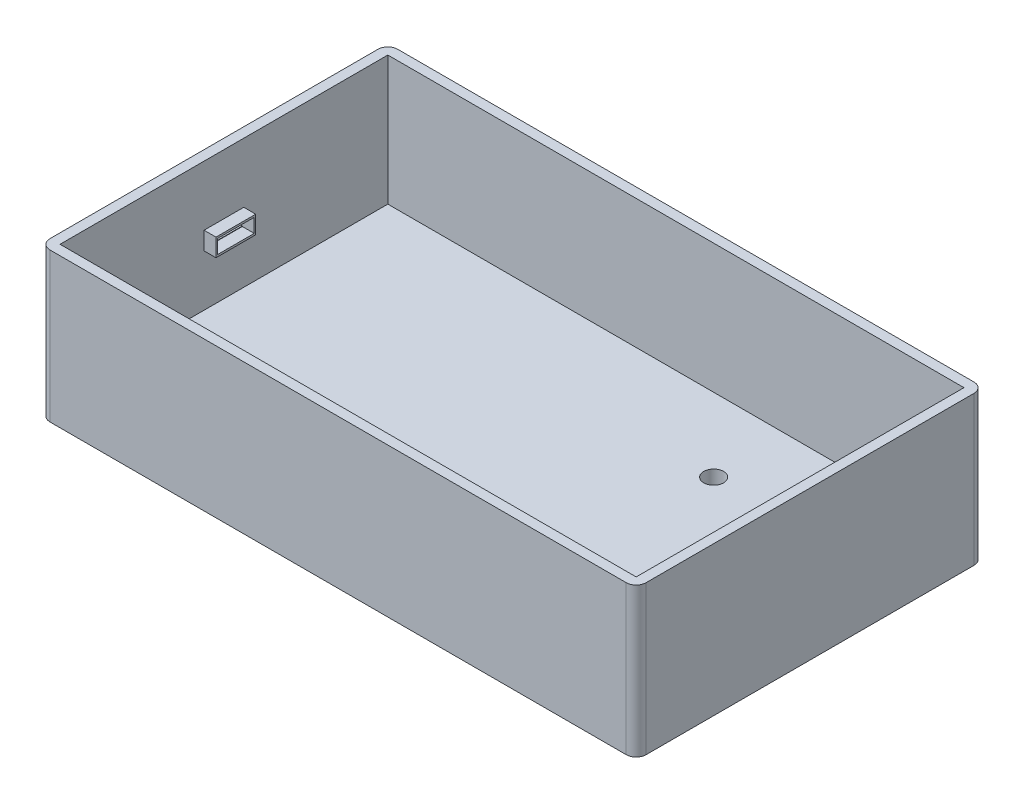
ISO-10303-21;
HEADER;
FILE_DESCRIPTION(('STEP AP214'),'2;1');
FILE_NAME('part.step','',(''),(''),'','','');
FILE_SCHEMA(('AUTOMOTIVE_DESIGN { 1 0 10303 214 1 1 1 1 }'));
ENDSEC;
DATA;
#1=APPLICATION_CONTEXT('core data for automotive mechanical design processes');
#2=APPLICATION_PROTOCOL_DEFINITION('international standard','automotive_design',2000,#1);
#3=PRODUCT_CONTEXT('',#1,'mechanical');
#4=PRODUCT('Part','Part','',(#3));
#5=PRODUCT_RELATED_PRODUCT_CATEGORY('part','',(#4));
#6=PRODUCT_DEFINITION_FORMATION('','',#4);
#7=PRODUCT_DEFINITION_CONTEXT('part definition',#1,'design');
#8=PRODUCT_DEFINITION('design','',#6,#7);
#9=PRODUCT_DEFINITION_SHAPE('','',#8);
#10=(LENGTH_UNIT() NAMED_UNIT(*) SI_UNIT(.MILLI.,.METRE.));
#11=(NAMED_UNIT(*) PLANE_ANGLE_UNIT() SI_UNIT($,.RADIAN.));
#12=(NAMED_UNIT(*) SI_UNIT($,.STERADIAN.) SOLID_ANGLE_UNIT());
#13=UNCERTAINTY_MEASURE_WITH_UNIT(LENGTH_MEASURE(1.E-05),#10,'distance_accuracy_value','');
#14=(GEOMETRIC_REPRESENTATION_CONTEXT(3) GLOBAL_UNCERTAINTY_ASSIGNED_CONTEXT((#13)) GLOBAL_UNIT_ASSIGNED_CONTEXT((#10,
#11,#12)) REPRESENTATION_CONTEXT('',''));
#15=CARTESIAN_POINT('',(0.,0.,0.));
#16=DIRECTION('',(0.,0.,1.));
#17=DIRECTION('',(1.,0.,0.));
#18=AXIS2_PLACEMENT_3D('',#15,#16,#17);
#19=CARTESIAN_POINT('',(-73.66,5.08,41.91));
#20=DIRECTION('',(-1.,0.,0.));
#21=DIRECTION('',(0.,0.,1.));
#22=AXIS2_PLACEMENT_3D('',#19,#20,#21);
#23=PLANE('',#22);
#24=DIRECTION('',(0.,0.,1.));
#25=VECTOR('',#24,1.);
#26=CARTESIAN_POINT('',(-73.66,38.1,41.91));
#27=LINE('',#26,#25);
#28=CARTESIAN_POINT('',(-73.66,38.1,-41.91));
#29=VERTEX_POINT('',#28);
#30=CARTESIAN_POINT('',(-73.66,38.1,41.91));
#31=VERTEX_POINT('',#30);
#32=EDGE_CURVE('E353',#29,#31,#27,.T.);
#33=ORIENTED_EDGE('',*,*,#32,.T.);
#34=DIRECTION('',(0.,1.,0.));
#35=VECTOR('',#34,1.);
#36=CARTESIAN_POINT('',(-73.66,5.08,41.91));
#37=LINE('',#36,#35);
#38=CARTESIAN_POINT('',(-73.66,5.08,41.91));
#39=VERTEX_POINT('',#38);
#40=EDGE_CURVE('E364',#39,#31,#37,.T.);
#41=ORIENTED_EDGE('',*,*,#40,.F.);
#42=DIRECTION('',(0.,0.,1.));
#43=VECTOR('',#42,1.);
#44=CARTESIAN_POINT('',(-73.66,5.08,41.91));
#45=LINE('',#44,#43);
#46=CARTESIAN_POINT('',(-73.66,5.08,-41.91));
#47=VERTEX_POINT('',#46);
#48=EDGE_CURVE('E338',#47,#39,#45,.T.);
#49=ORIENTED_EDGE('',*,*,#48,.F.);
#50=DIRECTION('',(0.,1.,0.));
#51=VECTOR('',#50,1.);
#52=CARTESIAN_POINT('',(-73.66,5.08,-41.91));
#53=LINE('',#52,#51);
#54=EDGE_CURVE('E367',#47,#29,#53,.T.);
#55=ORIENTED_EDGE('',*,*,#54,.T.);
#56=EDGE_LOOP('',(#33,#41,#49,#55));
#57=FACE_BOUND('',#56,.T.);
#58=DIRECTION('',(0.,1.,0.));
#59=VECTOR('',#58,1.);
#60=CARTESIAN_POINT('',(-73.66,18.2245,-5.08));
#61=LINE('',#60,#59);
#62=CARTESIAN_POINT('',(-73.66,18.2245,-5.08));
#63=VERTEX_POINT('',#62);
#64=CARTESIAN_POINT('',(-73.66,22.7965,-5.08));
#65=VERTEX_POINT('',#64);
#66=EDGE_CURVE('E249',#63,#65,#61,.T.);
#67=ORIENTED_EDGE('',*,*,#66,.F.);
#68=DIRECTION('',(0.,0.,-1.));
#69=VECTOR('',#68,1.);
#70=CARTESIAN_POINT('',(-73.66,18.2245,5.08));
#71=LINE('',#70,#69);
#72=CARTESIAN_POINT('',(-73.66,18.2245,5.07999999999999));
#73=VERTEX_POINT('',#72);
#74=EDGE_CURVE('E255',#73,#63,#71,.T.);
#75=ORIENTED_EDGE('',*,*,#74,.F.);
#76=DIRECTION('',(0.,-1.,0.));
#77=VECTOR('',#76,1.);
#78=CARTESIAN_POINT('',(-73.66,18.2245,5.08));
#79=LINE('',#78,#77);
#80=CARTESIAN_POINT('',(-73.66,22.7965,5.07999999999999));
#81=VERTEX_POINT('',#80);
#82=EDGE_CURVE('E68',#81,#73,#79,.T.);
#83=ORIENTED_EDGE('',*,*,#82,.F.);
#84=DIRECTION('',(0.,0.,1.));
#85=VECTOR('',#84,1.);
#86=CARTESIAN_POINT('',(-73.66,22.7965,5.08));
#87=LINE('',#86,#85);
#88=EDGE_CURVE('E63',#65,#81,#87,.T.);
#89=ORIENTED_EDGE('',*,*,#88,.F.);
#90=EDGE_LOOP('',(#67,#75,#83,#89));
#91=FACE_BOUND('',#90,.T.);
#92=ADVANCED_FACE('F47',(#57,#91),#23,.F.);
#93=CARTESIAN_POINT('',(76.2,38.1,44.45));
#94=DIRECTION('',(-1.,0.,0.));
#95=DIRECTION('',(0.,0.,1.));
#96=AXIS2_PLACEMENT_3D('',#93,#94,#95);
#97=PLANE('',#96);
#98=DIRECTION('',(0.,0.,-1.));
#99=VECTOR('',#98,1.);
#100=CARTESIAN_POINT('',(76.2,38.1,44.45));
#101=LINE('',#100,#99);
#102=CARTESIAN_POINT('',(76.2,38.1,41.91));
#103=VERTEX_POINT('',#102);
#104=CARTESIAN_POINT('',(76.2,38.1,-41.91));
#105=VERTEX_POINT('',#104);
#106=EDGE_CURVE('E373',#103,#105,#101,.T.);
#107=ORIENTED_EDGE('',*,*,#106,.F.);
#108=DIRECTION('',(0.,-1.,0.));
#109=VECTOR('',#108,1.);
#110=CARTESIAN_POINT('',(76.2,38.1,41.91));
#111=LINE('',#110,#109);
#112=CARTESIAN_POINT('',(76.2,0.,41.91));
#113=VERTEX_POINT('',#112);
#114=EDGE_CURVE('E11',#103,#113,#111,.T.);
#115=ORIENTED_EDGE('',*,*,#114,.T.);
#116=DIRECTION('',(0.,0.,-1.));
#117=VECTOR('',#116,1.);
#118=CARTESIAN_POINT('',(76.2,0.,44.45));
#119=LINE('',#118,#117);
#120=CARTESIAN_POINT('',(76.2,0.,-41.91));
#121=VERTEX_POINT('',#120);
#122=EDGE_CURVE('E363',#113,#121,#119,.T.);
#123=ORIENTED_EDGE('',*,*,#122,.T.);
#124=DIRECTION('',(0.,-1.,0.));
#125=VECTOR('',#124,1.);
#126=CARTESIAN_POINT('',(76.2,38.1,-41.91));
#127=LINE('',#126,#125);
#128=EDGE_CURVE('E56',#121,#105,#127,.F.);
#129=ORIENTED_EDGE('',*,*,#128,.T.);
#130=EDGE_LOOP('',(#107,#115,#123,#129));
#131=FACE_BOUND('',#130,.T.);
#132=ADVANCED_FACE('F452',(#131),#97,.F.);
#133=CARTESIAN_POINT('',(-76.2,38.1,-44.45));
#134=DIRECTION('',(0.,0.,1.));
#135=DIRECTION('',(1.,0.,0.));
#136=AXIS2_PLACEMENT_3D('',#133,#134,#135);
#137=PLANE('',#136);
#138=DIRECTION('',(-1.,0.,0.));
#139=VECTOR('',#138,1.);
#140=CARTESIAN_POINT('',(-76.2,0.,-44.45));
#141=LINE('',#140,#139);
#142=CARTESIAN_POINT('',(73.66,0.,-44.45));
#143=VERTEX_POINT('',#142);
#144=CARTESIAN_POINT('',(-73.66,0.,-44.45));
#145=VERTEX_POINT('',#144);
#146=EDGE_CURVE('E394',#143,#145,#141,.T.);
#147=ORIENTED_EDGE('',*,*,#146,.T.);
#148=DIRECTION('',(0.,-1.,0.));
#149=VECTOR('',#148,1.);
#150=CARTESIAN_POINT('',(-73.66,38.1,-44.45));
#151=LINE('',#150,#149);
#152=CARTESIAN_POINT('',(-73.66,38.1,-44.45));
#153=VERTEX_POINT('',#152);
#154=EDGE_CURVE('E446',#145,#153,#151,.F.);
#155=ORIENTED_EDGE('',*,*,#154,.T.);
#156=DIRECTION('',(-1.,0.,0.));
#157=VECTOR('',#156,1.);
#158=CARTESIAN_POINT('',(-76.2,38.1,-44.45));
#159=LINE('',#158,#157);
#160=CARTESIAN_POINT('',(73.66,38.1,-44.45));
#161=VERTEX_POINT('',#160);
#162=EDGE_CURVE('E377',#161,#153,#159,.T.);
#163=ORIENTED_EDGE('',*,*,#162,.F.);
#164=DIRECTION('',(0.,-1.,0.));
#165=VECTOR('',#164,1.);
#166=CARTESIAN_POINT('',(73.66,38.1,-44.45));
#167=LINE('',#166,#165);
#168=EDGE_CURVE('E442',#161,#143,#167,.T.);
#169=ORIENTED_EDGE('',*,*,#168,.T.);
#170=EDGE_LOOP('',(#147,#155,#163,#169));
#171=FACE_BOUND('',#170,.T.);
#172=ADVANCED_FACE('F464',(#171),#137,.F.);
#173=CARTESIAN_POINT('',(-76.2,38.1,44.45));
#174=DIRECTION('',(1.,0.,0.));
#175=DIRECTION('',(0.,0.,-1.));
#176=AXIS2_PLACEMENT_3D('',#173,#174,#175);
#177=PLANE('',#176);
#178=DIRECTION('',(0.,0.,-1.));
#179=VECTOR('',#178,1.);
#180=CARTESIAN_POINT('',(-76.2,22.2885,-4.699));
#181=LINE('',#180,#179);
#182=CARTESIAN_POINT('',(-76.2,22.2885,4.699));
#183=VERTEX_POINT('',#182);
#184=CARTESIAN_POINT('',(-76.2,22.2885,-4.699));
#185=VERTEX_POINT('',#184);
#186=EDGE_CURVE('E203',#183,#185,#181,.T.);
#187=ORIENTED_EDGE('',*,*,#186,.F.);
#188=DIRECTION('',(0.,1.,0.));
#189=VECTOR('',#188,1.);
#190=CARTESIAN_POINT('',(-76.2,18.8595,4.699));
#191=LINE('',#190,#189);
#192=CARTESIAN_POINT('',(-76.2,18.8595,4.699));
#193=VERTEX_POINT('',#192);
#194=EDGE_CURVE('E294',#193,#183,#191,.T.);
#195=ORIENTED_EDGE('',*,*,#194,.F.);
#196=DIRECTION('',(0.,0.,1.));
#197=VECTOR('',#196,1.);
#198=CARTESIAN_POINT('',(-76.2,18.8595,-4.699));
#199=LINE('',#198,#197);
#200=CARTESIAN_POINT('',(-76.2,18.8595,-4.699));
#201=VERTEX_POINT('',#200);
#202=EDGE_CURVE('E319',#201,#193,#199,.T.);
#203=ORIENTED_EDGE('',*,*,#202,.F.);
#204=DIRECTION('',(0.,-1.,0.));
#205=VECTOR('',#204,1.);
#206=CARTESIAN_POINT('',(-76.2,18.8595,-4.699));
#207=LINE('',#206,#205);
#208=EDGE_CURVE('E316',#185,#201,#207,.T.);
#209=ORIENTED_EDGE('',*,*,#208,.F.);
#210=EDGE_LOOP('',(#187,#195,#203,#209));
#211=FACE_BOUND('',#210,.T.);
#212=DIRECTION('',(0.,0.,1.));
#213=VECTOR('',#212,1.);
#214=CARTESIAN_POINT('',(-76.2,0.,44.45));
#215=LINE('',#214,#213);
#216=CARTESIAN_POINT('',(-76.2,0.,-41.91));
#217=VERTEX_POINT('',#216);
#218=CARTESIAN_POINT('',(-76.2,0.,41.91));
#219=VERTEX_POINT('',#218);
#220=EDGE_CURVE('E398',#217,#219,#215,.T.);
#221=ORIENTED_EDGE('',*,*,#220,.T.);
#222=DIRECTION('',(0.,-1.,0.));
#223=VECTOR('',#222,1.);
#224=CARTESIAN_POINT('',(-76.2,38.1,41.91));
#225=LINE('',#224,#223);
#226=CARTESIAN_POINT('',(-76.2,38.1,41.91));
#227=VERTEX_POINT('',#226);
#228=EDGE_CURVE('E427',#219,#227,#225,.F.);
#229=ORIENTED_EDGE('',*,*,#228,.T.);
#230=DIRECTION('',(0.,0.,1.));
#231=VECTOR('',#230,1.);
#232=CARTESIAN_POINT('',(-76.2,38.1,44.45));
#233=LINE('',#232,#231);
#234=CARTESIAN_POINT('',(-76.2,38.1,-41.91));
#235=VERTEX_POINT('',#234);
#236=EDGE_CURVE('E382',#235,#227,#233,.T.);
#237=ORIENTED_EDGE('',*,*,#236,.F.);
#238=DIRECTION('',(0.,-1.,0.));
#239=VECTOR('',#238,1.);
#240=CARTESIAN_POINT('',(-76.2,38.1,-41.91));
#241=LINE('',#240,#239);
#242=EDGE_CURVE('E423',#235,#217,#241,.T.);
#243=ORIENTED_EDGE('',*,*,#242,.T.);
#244=EDGE_LOOP('',(#221,#229,#237,#243));
#245=FACE_BOUND('',#244,.T.);
#246=ADVANCED_FACE('F476',(#211,#245),#177,.F.);
#247=CARTESIAN_POINT('',(-76.2,38.1,44.45));
#248=DIRECTION('',(0.,0.,-1.));
#249=DIRECTION('',(-1.,0.,0.));
#250=AXIS2_PLACEMENT_3D('',#247,#248,#249);
#251=PLANE('',#250);
#252=DIRECTION('',(1.,0.,0.));
#253=VECTOR('',#252,1.);
#254=CARTESIAN_POINT('',(-76.2,38.1,44.45));
#255=LINE('',#254,#253);
#256=CARTESIAN_POINT('',(-73.66,38.1,44.45));
#257=VERTEX_POINT('',#256);
#258=CARTESIAN_POINT('',(73.66,38.1,44.45));
#259=VERTEX_POINT('',#258);
#260=EDGE_CURVE('E386',#257,#259,#255,.T.);
#261=ORIENTED_EDGE('',*,*,#260,.F.);
#262=DIRECTION('',(0.,-1.,0.));
#263=VECTOR('',#262,1.);
#264=CARTESIAN_POINT('',(-73.66,38.1,44.45));
#265=LINE('',#264,#263);
#266=CARTESIAN_POINT('',(-73.66,0.,44.45));
#267=VERTEX_POINT('',#266);
#268=EDGE_CURVE('E407',#257,#267,#265,.T.);
#269=ORIENTED_EDGE('',*,*,#268,.T.);
#270=DIRECTION('',(1.,0.,0.));
#271=VECTOR('',#270,1.);
#272=CARTESIAN_POINT('',(-76.2,0.,44.45));
#273=LINE('',#272,#271);
#274=CARTESIAN_POINT('',(73.66,0.,44.45));
#275=VERTEX_POINT('',#274);
#276=EDGE_CURVE('E378',#267,#275,#273,.T.);
#277=ORIENTED_EDGE('',*,*,#276,.T.);
#278=DIRECTION('',(0.,-1.,0.));
#279=VECTOR('',#278,1.);
#280=CARTESIAN_POINT('',(73.66,38.1,44.45));
#281=LINE('',#280,#279);
#282=EDGE_CURVE('E390',#275,#259,#281,.F.);
#283=ORIENTED_EDGE('',*,*,#282,.T.);
#284=EDGE_LOOP('',(#261,#269,#277,#283));
#285=FACE_BOUND('',#284,.T.);
#286=ADVANCED_FACE('F484',(#285),#251,.F.);
#287=CARTESIAN_POINT('',(0.,38.1,0.));
#288=DIRECTION('',(0.,-1.,0.));
#289=DIRECTION('',(0.,0.,-1.));
#290=AXIS2_PLACEMENT_3D('',#287,#288,#289);
#291=PLANE('',#290);
#292=DIRECTION('',(-1.,0.,0.));
#293=VECTOR('',#292,1.);
#294=CARTESIAN_POINT('',(-73.66,38.1,-41.91));
#295=LINE('',#294,#293);
#296=CARTESIAN_POINT('',(73.66,38.1,-41.91));
#297=VERTEX_POINT('',#296);
#298=EDGE_CURVE('E349',#297,#29,#295,.T.);
#299=ORIENTED_EDGE('',*,*,#298,.F.);
#300=DIRECTION('',(0.,0.,-1.));
#301=VECTOR('',#300,1.);
#302=CARTESIAN_POINT('',(73.66,38.1,41.91));
#303=LINE('',#302,#301);
#304=CARTESIAN_POINT('',(73.66,38.1,41.91));
#305=VERTEX_POINT('',#304);
#306=EDGE_CURVE('E310',#305,#297,#303,.T.);
#307=ORIENTED_EDGE('',*,*,#306,.F.);
#308=DIRECTION('',(1.,0.,0.));
#309=VECTOR('',#308,1.);
#310=CARTESIAN_POINT('',(-73.66,38.1,41.91));
#311=LINE('',#310,#309);
#312=EDGE_CURVE('E334',#31,#305,#311,.T.);
#313=ORIENTED_EDGE('',*,*,#312,.F.);
#314=ORIENTED_EDGE('',*,*,#32,.F.);
#315=EDGE_LOOP('',(#299,#307,#313,#314));
#316=FACE_BOUND('',#315,.T.);
#317=ORIENTED_EDGE('',*,*,#236,.T.);
#318=CARTESIAN_POINT('',(-73.66,38.1,41.91));
#319=DIRECTION('',(0.,-1.,0.));
#320=DIRECTION('',(0.,0.,-1.));
#321=AXIS2_PLACEMENT_3D('',#318,#319,#320);
#322=CIRCLE('',#321,2.54);
#323=EDGE_CURVE('E439',#227,#257,#322,.F.);
#324=ORIENTED_EDGE('',*,*,#323,.T.);
#325=ORIENTED_EDGE('',*,*,#260,.T.);
#326=CARTESIAN_POINT('',(73.66,38.1,41.91));
#327=DIRECTION('',(0.,-1.,0.));
#328=DIRECTION('',(0.,0.,-1.));
#329=AXIS2_PLACEMENT_3D('',#326,#327,#328);
#330=CIRCLE('',#329,2.54);
#331=EDGE_CURVE('E433',#259,#103,#330,.F.);
#332=ORIENTED_EDGE('',*,*,#331,.T.);
#333=ORIENTED_EDGE('',*,*,#106,.T.);
#334=CARTESIAN_POINT('',(73.66,38.1,-41.91));
#335=DIRECTION('',(0.,-1.,0.));
#336=DIRECTION('',(0.,0.,-1.));
#337=AXIS2_PLACEMENT_3D('',#334,#335,#336);
#338=CIRCLE('',#337,2.54);
#339=EDGE_CURVE('E430',#105,#161,#338,.F.);
#340=ORIENTED_EDGE('',*,*,#339,.T.);
#341=ORIENTED_EDGE('',*,*,#162,.T.);
#342=CARTESIAN_POINT('',(-73.66,38.1,-41.91));
#343=DIRECTION('',(0.,-1.,0.));
#344=DIRECTION('',(0.,0.,-1.));
#345=AXIS2_PLACEMENT_3D('',#342,#343,#344);
#346=CIRCLE('',#345,2.54);
#347=EDGE_CURVE('E436',#153,#235,#346,.F.);
#348=ORIENTED_EDGE('',*,*,#347,.T.);
#349=EDGE_LOOP('',(#317,#324,#325,#332,#333,#340,#341,#348));
#350=FACE_BOUND('',#349,.T.);
#351=ADVANCED_FACE('F458',(#316,#350),#291,.F.);
#352=CARTESIAN_POINT('',(0.,0.,0.));
#353=DIRECTION('',(0.,-1.,0.));
#354=DIRECTION('',(0.,0.,-1.));
#355=AXIS2_PLACEMENT_3D('',#352,#353,#354);
#356=PLANE('',#355);
#357=CARTESIAN_POINT('',(28.448,0.,-23.114));
#358=DIRECTION('',(0.,1.,0.));
#359=DIRECTION('',(0.,0.,1.));
#360=AXIS2_PLACEMENT_3D('',#357,#358,#359);
#361=CIRCLE('',#360,2.54);
#362=CARTESIAN_POINT('',(28.448,0.,-20.574));
#363=VERTEX_POINT('',#362);
#364=EDGE_CURVE('E290',#363,#363,#361,.T.);
#365=ORIENTED_EDGE('',*,*,#364,.T.);
#366=EDGE_LOOP('',(#365));
#367=FACE_BOUND('',#366,.T.);
#368=CARTESIAN_POINT('',(28.448,0.,23.114));
#369=DIRECTION('',(0.,1.,0.));
#370=DIRECTION('',(0.,0.,-1.));
#371=AXIS2_PLACEMENT_3D('',#368,#369,#370);
#372=CIRCLE('',#371,2.54);
#373=CARTESIAN_POINT('',(28.448,0.,20.574));
#374=VERTEX_POINT('',#373);
#375=EDGE_CURVE('E289',#374,#374,#372,.T.);
#376=ORIENTED_EDGE('',*,*,#375,.T.);
#377=EDGE_LOOP('',(#376));
#378=FACE_BOUND('',#377,.T.);
#379=ORIENTED_EDGE('',*,*,#276,.F.);
#380=CARTESIAN_POINT('',(-73.66,0.,41.91));
#381=DIRECTION('',(0.,-1.,0.));
#382=DIRECTION('',(0.,0.,-1.));
#383=AXIS2_PLACEMENT_3D('',#380,#381,#382);
#384=CIRCLE('',#383,2.54);
#385=EDGE_CURVE('E420',#267,#219,#384,.T.);
#386=ORIENTED_EDGE('',*,*,#385,.T.);
#387=ORIENTED_EDGE('',*,*,#220,.F.);
#388=CARTESIAN_POINT('',(-73.66,0.,-41.91));
#389=DIRECTION('',(0.,-1.,0.));
#390=DIRECTION('',(0.,0.,-1.));
#391=AXIS2_PLACEMENT_3D('',#388,#389,#390);
#392=CIRCLE('',#391,2.54);
#393=EDGE_CURVE('E417',#217,#145,#392,.T.);
#394=ORIENTED_EDGE('',*,*,#393,.T.);
#395=ORIENTED_EDGE('',*,*,#146,.F.);
#396=CARTESIAN_POINT('',(73.66,0.,-41.91));
#397=DIRECTION('',(0.,-1.,0.));
#398=DIRECTION('',(0.,0.,-1.));
#399=AXIS2_PLACEMENT_3D('',#396,#397,#398);
#400=CIRCLE('',#399,2.54);
#401=EDGE_CURVE('E411',#143,#121,#400,.T.);
#402=ORIENTED_EDGE('',*,*,#401,.T.);
#403=ORIENTED_EDGE('',*,*,#122,.F.);
#404=CARTESIAN_POINT('',(73.66,0.,41.91));
#405=DIRECTION('',(0.,-1.,0.));
#406=DIRECTION('',(0.,0.,-1.));
#407=AXIS2_PLACEMENT_3D('',#404,#405,#406);
#408=CIRCLE('',#407,2.54);
#409=EDGE_CURVE('E414',#113,#275,#408,.T.);
#410=ORIENTED_EDGE('',*,*,#409,.T.);
#411=EDGE_LOOP('',(#379,#386,#387,#394,#395,#402,#403,#410));
#412=FACE_BOUND('',#411,.T.);
#413=ADVANCED_FACE('F468',(#367,#378,#412),#356,.T.);
#414=CARTESIAN_POINT('',(73.66,5.08,41.91));
#415=DIRECTION('',(1.,0.,0.));
#416=DIRECTION('',(0.,0.,-1.));
#417=AXIS2_PLACEMENT_3D('',#414,#415,#416);
#418=PLANE('',#417);
#419=ORIENTED_EDGE('',*,*,#306,.T.);
#420=DIRECTION('',(0.,1.,0.));
#421=VECTOR('',#420,1.);
#422=CARTESIAN_POINT('',(73.66,5.08,-41.91));
#423=LINE('',#422,#421);
#424=CARTESIAN_POINT('',(73.66,5.08,-41.91));
#425=VERTEX_POINT('',#424);
#426=EDGE_CURVE('E346',#425,#297,#423,.T.);
#427=ORIENTED_EDGE('',*,*,#426,.F.);
#428=DIRECTION('',(0.,0.,-1.));
#429=VECTOR('',#428,1.);
#430=CARTESIAN_POINT('',(73.66,5.08,41.91));
#431=LINE('',#430,#429);
#432=CARTESIAN_POINT('',(73.66,5.08,41.91));
#433=VERTEX_POINT('',#432);
#434=EDGE_CURVE('E329',#433,#425,#431,.T.);
#435=ORIENTED_EDGE('',*,*,#434,.F.);
#436=DIRECTION('',(0.,1.,0.));
#437=VECTOR('',#436,1.);
#438=CARTESIAN_POINT('',(73.66,5.08,41.91));
#439=LINE('',#438,#437);
#440=EDGE_CURVE('E360',#433,#305,#439,.T.);
#441=ORIENTED_EDGE('',*,*,#440,.T.);
#442=EDGE_LOOP('',(#419,#427,#435,#441));
#443=FACE_BOUND('',#442,.T.);
#444=ADVANCED_FACE('F517',(#443),#418,.F.);
#445=CARTESIAN_POINT('',(-73.66,5.08,41.91));
#446=DIRECTION('',(0.,0.,1.));
#447=DIRECTION('',(1.,0.,0.));
#448=AXIS2_PLACEMENT_3D('',#445,#446,#447);
#449=PLANE('',#448);
#450=ORIENTED_EDGE('',*,*,#312,.T.);
#451=ORIENTED_EDGE('',*,*,#440,.F.);
#452=DIRECTION('',(1.,0.,0.));
#453=VECTOR('',#452,1.);
#454=CARTESIAN_POINT('',(-73.66,5.08,41.91));
#455=LINE('',#454,#453);
#456=EDGE_CURVE('E342',#39,#433,#455,.T.);
#457=ORIENTED_EDGE('',*,*,#456,.F.);
#458=ORIENTED_EDGE('',*,*,#40,.T.);
#459=EDGE_LOOP('',(#450,#451,#457,#458));
#460=FACE_BOUND('',#459,.T.);
#461=ADVANCED_FACE('F508',(#460),#449,.F.);
#462=DIRECTION('',(0.,0.,-1.));
#463=VECTOR('',#462,1.);
#464=CARTESIAN_POINT('',(-73.66,18.7325,4.69899999999999));
#465=LINE('',#464,#463);
#466=CARTESIAN_POINT('',(-73.66,18.7325,4.69899999999999));
#467=VERTEX_POINT('',#466);
#468=CARTESIAN_POINT('',(-73.66,18.7325,-4.69899999999999));
#469=VERTEX_POINT('',#468);
#470=EDGE_CURVE('E221',#467,#469,#465,.T.);
#471=ORIENTED_EDGE('',*,*,#470,.T.);
#472=DIRECTION('',(0.,1.,0.));
#473=VECTOR('',#472,1.);
#474=CARTESIAN_POINT('',(-73.66,18.7325,-4.69899999999999));
#475=LINE('',#474,#473);
#476=CARTESIAN_POINT('',(-73.66,18.8595,-4.69899999999999));
#477=VERTEX_POINT('',#476);
#478=EDGE_CURVE('E234',#469,#477,#475,.T.);
#479=ORIENTED_EDGE('',*,*,#478,.T.);
#480=DIRECTION('',(0.,0.,-1.));
#481=VECTOR('',#480,1.);
#482=CARTESIAN_POINT('',(-73.66,18.8595,-4.699));
#483=LINE('',#482,#481);
#484=CARTESIAN_POINT('',(-73.66,18.8595,4.69899999999999));
#485=VERTEX_POINT('',#484);
#486=EDGE_CURVE('E306',#485,#477,#483,.T.);
#487=ORIENTED_EDGE('',*,*,#486,.F.);
#488=DIRECTION('',(0.,-1.,0.));
#489=VECTOR('',#488,1.);
#490=CARTESIAN_POINT('',(-73.66,18.7325,4.69899999999999));
#491=LINE('',#490,#489);
#492=EDGE_CURVE('E237',#485,#467,#491,.T.);
#493=ORIENTED_EDGE('',*,*,#492,.T.);
#494=EDGE_LOOP('',(#471,#479,#487,#493));
#495=FACE_BOUND('',#494,.T.);
#496=ADVANCED_FACE('F498',(#495),#23,.F.);
#497=CARTESIAN_POINT('',(-73.66,5.08,-41.91));
#498=DIRECTION('',(0.,0.,-1.));
#499=DIRECTION('',(-1.,0.,0.));
#500=AXIS2_PLACEMENT_3D('',#497,#498,#499);
#501=PLANE('',#500);
#502=ORIENTED_EDGE('',*,*,#298,.T.);
#503=ORIENTED_EDGE('',*,*,#54,.F.);
#504=DIRECTION('',(-1.,0.,0.));
#505=VECTOR('',#504,1.);
#506=CARTESIAN_POINT('',(-73.66,5.08,-41.91));
#507=LINE('',#506,#505);
#508=EDGE_CURVE('E333',#425,#47,#507,.T.);
#509=ORIENTED_EDGE('',*,*,#508,.F.);
#510=ORIENTED_EDGE('',*,*,#426,.T.);
#511=EDGE_LOOP('',(#502,#503,#509,#510));
#512=FACE_BOUND('',#511,.T.);
#513=ADVANCED_FACE('F507',(#512),#501,.F.);
#514=CARTESIAN_POINT('',(0.,5.08,0.));
#515=DIRECTION('',(0.,-1.,0.));
#516=DIRECTION('',(0.,0.,-1.));
#517=AXIS2_PLACEMENT_3D('',#514,#515,#516);
#518=PLANE('',#517);
#519=CARTESIAN_POINT('',(28.448,5.08,-23.114));
#520=DIRECTION('',(0.,1.,0.));
#521=DIRECTION('',(0.,0.,1.));
#522=AXIS2_PLACEMENT_3D('',#519,#520,#521);
#523=CIRCLE('',#522,2.54);
#524=CARTESIAN_POINT('',(28.448,5.08,-20.574));
#525=VERTEX_POINT('',#524);
#526=EDGE_CURVE('E295',#525,#525,#523,.T.);
#527=ORIENTED_EDGE('',*,*,#526,.F.);
#528=EDGE_LOOP('',(#527));
#529=FACE_BOUND('',#528,.T.);
#530=CARTESIAN_POINT('',(28.448,5.08,23.114));
#531=DIRECTION('',(0.,1.,0.));
#532=DIRECTION('',(0.,0.,-1.));
#533=AXIS2_PLACEMENT_3D('',#530,#531,#532);
#534=CIRCLE('',#533,2.54);
#535=CARTESIAN_POINT('',(28.448,5.08,20.574));
#536=VERTEX_POINT('',#535);
#537=EDGE_CURVE('E299',#536,#536,#534,.T.);
#538=ORIENTED_EDGE('',*,*,#537,.F.);
#539=EDGE_LOOP('',(#538));
#540=FACE_BOUND('',#539,.T.);
#541=ORIENTED_EDGE('',*,*,#434,.T.);
#542=ORIENTED_EDGE('',*,*,#508,.T.);
#543=ORIENTED_EDGE('',*,*,#48,.T.);
#544=ORIENTED_EDGE('',*,*,#456,.T.);
#545=EDGE_LOOP('',(#541,#542,#543,#544));
#546=FACE_BOUND('',#545,.T.);
#547=ADVANCED_FACE('F514',(#529,#540,#546),#518,.F.);
#548=CARTESIAN_POINT('',(-63.6559785585995,18.8595,4.699));
#549=DIRECTION('',(0.,0.,1.));
#550=DIRECTION('',(1.,0.,0.));
#551=AXIS2_PLACEMENT_3D('',#548,#549,#550);
#552=PLANE('',#551);
#553=DIRECTION('',(-1.,0.,0.));
#554=VECTOR('',#553,1.);
#555=CARTESIAN_POINT('',(-63.6559785585995,22.2885,4.699));
#556=LINE('',#555,#554);
#557=CARTESIAN_POINT('',(-70.612,22.2885,4.69899999999999));
#558=VERTEX_POINT('',#557);
#559=EDGE_CURVE('E209',#558,#183,#556,.T.);
#560=ORIENTED_EDGE('',*,*,#559,.F.);
#561=DIRECTION('',(0.,-1.,0.));
#562=VECTOR('',#561,1.);
#563=CARTESIAN_POINT('',(-70.612,18.7325,4.69899999999999));
#564=LINE('',#563,#562);
#565=CARTESIAN_POINT('',(-70.612,18.7325,4.69899999999999));
#566=VERTEX_POINT('',#565);
#567=EDGE_CURVE('E225',#558,#566,#564,.T.);
#568=ORIENTED_EDGE('',*,*,#567,.T.);
#569=DIRECTION('',(-1.,0.,0.));
#570=VECTOR('',#569,1.);
#571=CARTESIAN_POINT('',(-70.612,18.7325,4.69899999999999));
#572=LINE('',#571,#570);
#573=EDGE_CURVE('E246',#566,#467,#572,.T.);
#574=ORIENTED_EDGE('',*,*,#573,.T.);
#575=ORIENTED_EDGE('',*,*,#492,.F.);
#576=DIRECTION('',(-1.,0.,0.));
#577=VECTOR('',#576,1.);
#578=CARTESIAN_POINT('',(-63.6559785585995,18.8595,4.699));
#579=LINE('',#578,#577);
#580=EDGE_CURVE('E311',#485,#193,#579,.T.);
#581=ORIENTED_EDGE('',*,*,#580,.T.);
#582=ORIENTED_EDGE('',*,*,#194,.T.);
#583=EDGE_LOOP('',(#560,#568,#574,#575,#581,#582));
#584=FACE_BOUND('',#583,.T.);
#585=ADVANCED_FACE('F524',(#584),#552,.F.);
#586=CARTESIAN_POINT('',(-63.6559785585995,18.8595,-4.699));
#587=DIRECTION('',(0.,-1.,0.));
#588=DIRECTION('',(0.,0.,-1.));
#589=AXIS2_PLACEMENT_3D('',#586,#587,#588);
#590=PLANE('',#589);
#591=ORIENTED_EDGE('',*,*,#486,.T.);
#592=DIRECTION('',(-1.,0.,0.));
#593=VECTOR('',#592,1.);
#594=CARTESIAN_POINT('',(-63.6559785585995,18.8595,-4.699));
#595=LINE('',#594,#593);
#596=EDGE_CURVE('E208',#477,#201,#595,.T.);
#597=ORIENTED_EDGE('',*,*,#596,.T.);
#598=ORIENTED_EDGE('',*,*,#202,.T.);
#599=ORIENTED_EDGE('',*,*,#580,.F.);
#600=EDGE_LOOP('',(#591,#597,#598,#599));
#601=FACE_BOUND('',#600,.T.);
#602=ADVANCED_FACE('F529',(#601),#590,.F.);
#603=CARTESIAN_POINT('',(-63.6559785585995,18.8595,-4.699));
#604=DIRECTION('',(0.,0.,-1.));
#605=DIRECTION('',(-1.,0.,0.));
#606=AXIS2_PLACEMENT_3D('',#603,#604,#605);
#607=PLANE('',#606);
#608=ORIENTED_EDGE('',*,*,#596,.F.);
#609=ORIENTED_EDGE('',*,*,#478,.F.);
#610=DIRECTION('',(-1.,0.,0.));
#611=VECTOR('',#610,1.);
#612=CARTESIAN_POINT('',(-70.612,18.7325,-4.69899999999999));
#613=LINE('',#612,#611);
#614=CARTESIAN_POINT('',(-70.612,18.7325,-4.69899999999999));
#615=VERTEX_POINT('',#614);
#616=EDGE_CURVE('E217',#615,#469,#613,.T.);
#617=ORIENTED_EDGE('',*,*,#616,.F.);
#618=DIRECTION('',(0.,1.,0.));
#619=VECTOR('',#618,1.);
#620=CARTESIAN_POINT('',(-70.612,18.7325,-4.69899999999999));
#621=LINE('',#620,#619);
#622=CARTESIAN_POINT('',(-70.612,22.2885,-4.69899999999999));
#623=VERTEX_POINT('',#622);
#624=EDGE_CURVE('E213',#615,#623,#621,.T.);
#625=ORIENTED_EDGE('',*,*,#624,.T.);
#626=DIRECTION('',(-1.,0.,0.));
#627=VECTOR('',#626,1.);
#628=CARTESIAN_POINT('',(-63.6559785585995,22.2885,-4.699));
#629=LINE('',#628,#627);
#630=EDGE_CURVE('E195',#623,#185,#629,.T.);
#631=ORIENTED_EDGE('',*,*,#630,.T.);
#632=ORIENTED_EDGE('',*,*,#208,.T.);
#633=EDGE_LOOP('',(#608,#609,#617,#625,#631,#632));
#634=FACE_BOUND('',#633,.T.);
#635=ADVANCED_FACE('F215',(#634),#607,.F.);
#636=CARTESIAN_POINT('',(-63.6559785585995,22.2885,-4.699));
#637=DIRECTION('',(0.,1.,0.));
#638=DIRECTION('',(0.,0.,1.));
#639=AXIS2_PLACEMENT_3D('',#636,#637,#638);
#640=PLANE('',#639);
#641=ORIENTED_EDGE('',*,*,#630,.F.);
#642=DIRECTION('',(0.,0.,1.));
#643=VECTOR('',#642,1.);
#644=CARTESIAN_POINT('',(-70.612,22.2885,4.69899999999999));
#645=LINE('',#644,#643);
#646=EDGE_CURVE('E200',#623,#558,#645,.T.);
#647=ORIENTED_EDGE('',*,*,#646,.T.);
#648=ORIENTED_EDGE('',*,*,#559,.T.);
#649=ORIENTED_EDGE('',*,*,#186,.T.);
#650=EDGE_LOOP('',(#641,#647,#648,#649));
#651=FACE_BOUND('',#650,.T.);
#652=ADVANCED_FACE('F197',(#651),#640,.F.);
#653=CARTESIAN_POINT('',(-73.66,38.1,41.91));
#654=DIRECTION('',(0.,-1.,0.));
#655=DIRECTION('',(0.,0.,-1.));
#656=AXIS2_PLACEMENT_3D('',#653,#654,#655);
#657=CYLINDRICAL_SURFACE('',#656,2.54);
#658=ORIENTED_EDGE('',*,*,#323,.F.);
#659=ORIENTED_EDGE('',*,*,#228,.F.);
#660=ORIENTED_EDGE('',*,*,#385,.F.);
#661=ORIENTED_EDGE('',*,*,#268,.F.);
#662=EDGE_LOOP('',(#658,#659,#660,#661));
#663=FACE_BOUND('',#662,.T.);
#664=ADVANCED_FACE('F482',(#663),#657,.T.);
#665=CARTESIAN_POINT('',(-73.66,38.1,-41.91));
#666=DIRECTION('',(0.,-1.,0.));
#667=DIRECTION('',(0.,0.,-1.));
#668=AXIS2_PLACEMENT_3D('',#665,#666,#667);
#669=CYLINDRICAL_SURFACE('',#668,2.54);
#670=ORIENTED_EDGE('',*,*,#347,.F.);
#671=ORIENTED_EDGE('',*,*,#154,.F.);
#672=ORIENTED_EDGE('',*,*,#393,.F.);
#673=ORIENTED_EDGE('',*,*,#242,.F.);
#674=EDGE_LOOP('',(#670,#671,#672,#673));
#675=FACE_BOUND('',#674,.T.);
#676=ADVANCED_FACE('F473',(#675),#669,.T.);
#677=CARTESIAN_POINT('',(73.66,38.1,41.91));
#678=DIRECTION('',(0.,-1.,0.));
#679=DIRECTION('',(0.,0.,-1.));
#680=AXIS2_PLACEMENT_3D('',#677,#678,#679);
#681=CYLINDRICAL_SURFACE('',#680,2.54);
#682=ORIENTED_EDGE('',*,*,#331,.F.);
#683=ORIENTED_EDGE('',*,*,#282,.F.);
#684=ORIENTED_EDGE('',*,*,#409,.F.);
#685=ORIENTED_EDGE('',*,*,#114,.F.);
#686=EDGE_LOOP('',(#682,#683,#684,#685));
#687=FACE_BOUND('',#686,.T.);
#688=ADVANCED_FACE('F487',(#687),#681,.T.);
#689=CARTESIAN_POINT('',(73.66,38.1,-41.91));
#690=DIRECTION('',(0.,-1.,0.));
#691=DIRECTION('',(0.,0.,-1.));
#692=AXIS2_PLACEMENT_3D('',#689,#690,#691);
#693=CYLINDRICAL_SURFACE('',#692,2.54);
#694=ORIENTED_EDGE('',*,*,#339,.F.);
#695=ORIENTED_EDGE('',*,*,#128,.F.);
#696=ORIENTED_EDGE('',*,*,#401,.F.);
#697=ORIENTED_EDGE('',*,*,#168,.F.);
#698=EDGE_LOOP('',(#694,#695,#696,#697));
#699=FACE_BOUND('',#698,.T.);
#700=ADVANCED_FACE('F49',(#699),#693,.T.);
#701=CARTESIAN_POINT('',(28.448,0.,23.114));
#702=DIRECTION('',(0.,1.,0.));
#703=DIRECTION('',(0.,0.,1.));
#704=AXIS2_PLACEMENT_3D('',#701,#702,#703);
#705=CYLINDRICAL_SURFACE('',#704,2.54);
#706=ORIENTED_EDGE('',*,*,#375,.F.);
#707=EDGE_LOOP('',(#706));
#708=FACE_BOUND('',#707,.T.);
#709=ORIENTED_EDGE('',*,*,#537,.T.);
#710=EDGE_LOOP('',(#709));
#711=FACE_BOUND('',#710,.T.);
#712=ADVANCED_FACE('F493',(#708,#711),#705,.F.);
#713=CARTESIAN_POINT('',(28.448,0.,-23.114));
#714=DIRECTION('',(0.,1.,0.));
#715=DIRECTION('',(0.,0.,1.));
#716=AXIS2_PLACEMENT_3D('',#713,#714,#715);
#717=CYLINDRICAL_SURFACE('',#716,2.54);
#718=ORIENTED_EDGE('',*,*,#364,.F.);
#719=EDGE_LOOP('',(#718));
#720=FACE_BOUND('',#719,.T.);
#721=ORIENTED_EDGE('',*,*,#526,.T.);
#722=EDGE_LOOP('',(#721));
#723=FACE_BOUND('',#722,.T.);
#724=ADVANCED_FACE('F605',(#720,#723),#717,.F.);
#725=CARTESIAN_POINT('',(-70.612,0.,0.));
#726=DIRECTION('',(-1.,0.,0.));
#727=DIRECTION('',(0.,0.,1.));
#728=AXIS2_PLACEMENT_3D('',#725,#726,#727);
#729=PLANE('',#728);
#730=DIRECTION('',(0.,1.,0.));
#731=VECTOR('',#730,1.);
#732=CARTESIAN_POINT('',(-70.612,18.2245,-5.08));
#733=LINE('',#732,#731);
#734=CARTESIAN_POINT('',(-70.612,18.2245,-5.08));
#735=VERTEX_POINT('',#734);
#736=CARTESIAN_POINT('',(-70.612,22.7965,-5.08));
#737=VERTEX_POINT('',#736);
#738=EDGE_CURVE('E250',#735,#737,#733,.T.);
#739=ORIENTED_EDGE('',*,*,#738,.T.);
#740=DIRECTION('',(0.,0.,1.));
#741=VECTOR('',#740,1.);
#742=CARTESIAN_POINT('',(-70.612,22.7965,5.08));
#743=LINE('',#742,#741);
#744=CARTESIAN_POINT('',(-70.612,22.7965,5.08));
#745=VERTEX_POINT('',#744);
#746=EDGE_CURVE('E254',#737,#745,#743,.T.);
#747=ORIENTED_EDGE('',*,*,#746,.T.);
#748=DIRECTION('',(0.,-1.,0.));
#749=VECTOR('',#748,1.);
#750=CARTESIAN_POINT('',(-70.612,18.2245,5.08));
#751=LINE('',#750,#749);
#752=CARTESIAN_POINT('',(-70.612,18.2245,5.08));
#753=VERTEX_POINT('',#752);
#754=EDGE_CURVE('E258',#745,#753,#751,.T.);
#755=ORIENTED_EDGE('',*,*,#754,.T.);
#756=DIRECTION('',(0.,0.,-1.));
#757=VECTOR('',#756,1.);
#758=CARTESIAN_POINT('',(-70.612,18.2245,5.08));
#759=LINE('',#758,#757);
#760=EDGE_CURVE('E261',#753,#735,#759,.T.);
#761=ORIENTED_EDGE('',*,*,#760,.T.);
#762=EDGE_LOOP('',(#739,#747,#755,#761));
#763=FACE_BOUND('',#762,.T.);
#764=ORIENTED_EDGE('',*,*,#624,.F.);
#765=DIRECTION('',(0.,0.,-1.));
#766=VECTOR('',#765,1.);
#767=CARTESIAN_POINT('',(-70.612,18.7325,4.69899999999999));
#768=LINE('',#767,#766);
#769=EDGE_CURVE('E229',#566,#615,#768,.T.);
#770=ORIENTED_EDGE('',*,*,#769,.F.);
#771=ORIENTED_EDGE('',*,*,#567,.F.);
#772=ORIENTED_EDGE('',*,*,#646,.F.);
#773=EDGE_LOOP('',(#764,#770,#771,#772));
#774=FACE_BOUND('',#773,.T.);
#775=ADVANCED_FACE('F223',(#763,#774),#729,.F.);
#776=CARTESIAN_POINT('',(-70.612,18.2245,-5.08));
#777=DIRECTION('',(0.,0.,1.));
#778=DIRECTION('',(1.,0.,0.));
#779=AXIS2_PLACEMENT_3D('',#776,#777,#778);
#780=PLANE('',#779);
#781=ORIENTED_EDGE('',*,*,#66,.T.);
#782=DIRECTION('',(-1.,0.,0.));
#783=VECTOR('',#782,1.);
#784=CARTESIAN_POINT('',(-70.612,22.7965,-5.08));
#785=LINE('',#784,#783);
#786=EDGE_CURVE('E286',#737,#65,#785,.T.);
#787=ORIENTED_EDGE('',*,*,#786,.F.);
#788=ORIENTED_EDGE('',*,*,#738,.F.);
#789=DIRECTION('',(-1.,0.,0.));
#790=VECTOR('',#789,1.);
#791=CARTESIAN_POINT('',(-70.612,18.2245,-5.08));
#792=LINE('',#791,#790);
#793=EDGE_CURVE('E264',#735,#63,#792,.T.);
#794=ORIENTED_EDGE('',*,*,#793,.T.);
#795=EDGE_LOOP('',(#781,#787,#788,#794));
#796=FACE_BOUND('',#795,.T.);
#797=ADVANCED_FACE('F648',(#796),#780,.F.);
#798=CARTESIAN_POINT('',(-70.612,22.7965,5.08));
#799=DIRECTION('',(0.,-1.,0.));
#800=DIRECTION('',(0.,0.,-1.));
#801=AXIS2_PLACEMENT_3D('',#798,#799,#800);
#802=PLANE('',#801);
#803=ORIENTED_EDGE('',*,*,#88,.T.);
#804=DIRECTION('',(-1.,0.,0.));
#805=VECTOR('',#804,1.);
#806=CARTESIAN_POINT('',(-70.612,22.7965,5.08));
#807=LINE('',#806,#805);
#808=EDGE_CURVE('E282',#745,#81,#807,.T.);
#809=ORIENTED_EDGE('',*,*,#808,.F.);
#810=ORIENTED_EDGE('',*,*,#746,.F.);
#811=ORIENTED_EDGE('',*,*,#786,.T.);
#812=EDGE_LOOP('',(#803,#809,#810,#811));
#813=FACE_BOUND('',#812,.T.);
#814=ADVANCED_FACE('F658',(#813),#802,.F.);
#815=CARTESIAN_POINT('',(-70.612,18.2245,5.08));
#816=DIRECTION('',(0.,0.,-1.));
#817=DIRECTION('',(-1.,0.,0.));
#818=AXIS2_PLACEMENT_3D('',#815,#816,#817);
#819=PLANE('',#818);
#820=ORIENTED_EDGE('',*,*,#82,.T.);
#821=DIRECTION('',(-1.,0.,0.));
#822=VECTOR('',#821,1.);
#823=CARTESIAN_POINT('',(-70.612,18.2245,5.08));
#824=LINE('',#823,#822);
#825=EDGE_CURVE('E278',#753,#73,#824,.T.);
#826=ORIENTED_EDGE('',*,*,#825,.F.);
#827=ORIENTED_EDGE('',*,*,#754,.F.);
#828=ORIENTED_EDGE('',*,*,#808,.T.);
#829=EDGE_LOOP('',(#820,#826,#827,#828));
#830=FACE_BOUND('',#829,.T.);
#831=ADVANCED_FACE('F668',(#830),#819,.F.);
#832=CARTESIAN_POINT('',(-70.612,18.2245,5.08));
#833=DIRECTION('',(0.,1.,0.));
#834=DIRECTION('',(0.,0.,1.));
#835=AXIS2_PLACEMENT_3D('',#832,#833,#834);
#836=PLANE('',#835);
#837=ORIENTED_EDGE('',*,*,#74,.T.);
#838=ORIENTED_EDGE('',*,*,#793,.F.);
#839=ORIENTED_EDGE('',*,*,#760,.F.);
#840=ORIENTED_EDGE('',*,*,#825,.T.);
#841=EDGE_LOOP('',(#837,#838,#839,#840));
#842=FACE_BOUND('',#841,.T.);
#843=ADVANCED_FACE('F678',(#842),#836,.F.);
#844=CARTESIAN_POINT('',(-70.612,18.7325,4.69899999999999));
#845=DIRECTION('',(0.,1.,0.));
#846=DIRECTION('',(0.,0.,1.));
#847=AXIS2_PLACEMENT_3D('',#844,#845,#846);
#848=PLANE('',#847);
#849=ORIENTED_EDGE('',*,*,#470,.F.);
#850=ORIENTED_EDGE('',*,*,#573,.F.);
#851=ORIENTED_EDGE('',*,*,#769,.T.);
#852=ORIENTED_EDGE('',*,*,#616,.T.);
#853=EDGE_LOOP('',(#849,#850,#851,#852));
#854=FACE_BOUND('',#853,.T.);
#855=ADVANCED_FACE('F522',(#854),#848,.T.);
#856=CLOSED_SHELL('',(#92,#132,#172,#246,#286,#351,#413,#444,#461,#496,#513,#547,#585,#602,#635,
#652,#664,#676,#688,#700,#712,#724,#775,#797,#814,#831,#843,#855));
#857=MANIFOLD_SOLID_BREP('B2',#856);
#858=ADVANCED_BREP_SHAPE_REPRESENTATION('',(#18,#857),#14);
#859=SHAPE_DEFINITION_REPRESENTATION(#9,#858);
ENDSEC;
END-ISO-10303-21;
